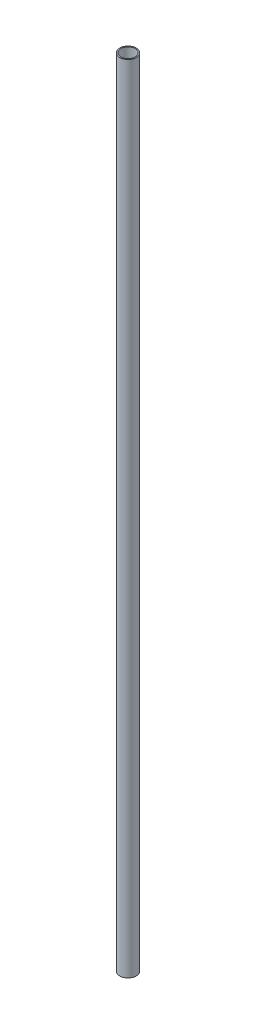
ISO-10303-21;
HEADER;
FILE_DESCRIPTION(('STEP AP214'),'2;1');
FILE_NAME('part.step','',(''),(''),'','','');
FILE_SCHEMA(('AUTOMOTIVE_DESIGN { 1 0 10303 214 1 1 1 1 }'));
ENDSEC;
DATA;
#1=APPLICATION_CONTEXT('core data for automotive mechanical design processes');
#2=APPLICATION_PROTOCOL_DEFINITION('international standard','automotive_design',2000,#1);
#3=PRODUCT_CONTEXT('',#1,'mechanical');
#4=PRODUCT('Part','Part','',(#3));
#5=PRODUCT_RELATED_PRODUCT_CATEGORY('part','',(#4));
#6=PRODUCT_DEFINITION_FORMATION('','',#4);
#7=PRODUCT_DEFINITION_CONTEXT('part definition',#1,'design');
#8=PRODUCT_DEFINITION('design','',#6,#7);
#9=PRODUCT_DEFINITION_SHAPE('','',#8);
#10=(LENGTH_UNIT() NAMED_UNIT(*) SI_UNIT(.MILLI.,.METRE.));
#11=(NAMED_UNIT(*) PLANE_ANGLE_UNIT() SI_UNIT($,.RADIAN.));
#12=(NAMED_UNIT(*) SI_UNIT($,.STERADIAN.) SOLID_ANGLE_UNIT());
#13=UNCERTAINTY_MEASURE_WITH_UNIT(LENGTH_MEASURE(1.E-05),#10,'distance_accuracy_value','');
#14=(GEOMETRIC_REPRESENTATION_CONTEXT(3) GLOBAL_UNCERTAINTY_ASSIGNED_CONTEXT((#13)) GLOBAL_UNIT_ASSIGNED_CONTEXT((#10,
#11,#12)) REPRESENTATION_CONTEXT('',''));
#15=CARTESIAN_POINT('',(0.,0.,0.));
#16=DIRECTION('',(0.,0.,1.));
#17=DIRECTION('',(1.,0.,0.));
#18=AXIS2_PLACEMENT_3D('',#15,#16,#17);
#19=CARTESIAN_POINT('',(0.,914.4,0.));
#20=DIRECTION('',(0.,1.,0.));
#21=DIRECTION('',(0.,0.,1.));
#22=AXIS2_PLACEMENT_3D('',#19,#20,#21);
#23=PLANE('',#22);
#24=CARTESIAN_POINT('',(0.,914.4,0.));
#25=DIRECTION('',(0.,1.,0.));
#26=DIRECTION('',(0.,0.,1.));
#27=AXIS2_PLACEMENT_3D('',#24,#25,#26);
#28=CIRCLE('',#27,9.525);
#29=CARTESIAN_POINT('',(0.,914.4,-9.525));
#30=VERTEX_POINT('',#29);
#31=EDGE_CURVE('E10',#30,#30,#28,.T.);
#32=ORIENTED_EDGE('',*,*,#31,.T.);
#33=EDGE_LOOP('',(#32));
#34=FACE_BOUND('',#33,.T.);
#35=CARTESIAN_POINT('',(0.,914.4,0.));
#36=DIRECTION('',(0.,1.,0.));
#37=DIRECTION('',(0.,0.,1.));
#38=AXIS2_PLACEMENT_3D('',#35,#36,#37);
#39=CIRCLE('',#38,8.2804);
#40=CARTESIAN_POINT('',(0.,914.4,-8.2804));
#41=VERTEX_POINT('',#40);
#42=EDGE_CURVE('E49',#41,#41,#39,.T.);
#43=ORIENTED_EDGE('',*,*,#42,.F.);
#44=EDGE_LOOP('',(#43));
#45=FACE_BOUND('',#44,.T.);
#46=ADVANCED_FACE('F38',(#34,#45),#23,.T.);
#47=CARTESIAN_POINT('',(0.,0.,0.));
#48=DIRECTION('',(0.,1.,0.));
#49=DIRECTION('',(0.,0.,1.));
#50=AXIS2_PLACEMENT_3D('',#47,#48,#49);
#51=PLANE('',#50);
#52=CARTESIAN_POINT('',(0.,0.,0.));
#53=DIRECTION('',(0.,1.,0.));
#54=DIRECTION('',(0.,0.,1.));
#55=AXIS2_PLACEMENT_3D('',#52,#53,#54);
#56=CIRCLE('',#55,9.525);
#57=CARTESIAN_POINT('',(0.,-1.11022302462516E-13,-9.525));
#58=VERTEX_POINT('',#57);
#59=EDGE_CURVE('E42',#58,#58,#56,.T.);
#60=ORIENTED_EDGE('',*,*,#59,.F.);
#61=EDGE_LOOP('',(#60));
#62=FACE_BOUND('',#61,.T.);
#63=CARTESIAN_POINT('',(0.,0.,0.));
#64=DIRECTION('',(0.,1.,0.));
#65=DIRECTION('',(0.,0.,1.));
#66=AXIS2_PLACEMENT_3D('',#63,#64,#65);
#67=CIRCLE('',#66,8.2804);
#68=CARTESIAN_POINT('',(0.,-1.11022302462516E-13,-8.2804));
#69=VERTEX_POINT('',#68);
#70=EDGE_CURVE('E51',#69,#69,#67,.T.);
#71=ORIENTED_EDGE('',*,*,#70,.T.);
#72=EDGE_LOOP('',(#71));
#73=FACE_BOUND('',#72,.T.);
#74=ADVANCED_FACE('F61',(#62,#73),#51,.F.);
#75=CARTESIAN_POINT('',(0.,914.4,0.));
#76=DIRECTION('',(0.,-1.,0.));
#77=DIRECTION('',(0.,0.,-1.));
#78=AXIS2_PLACEMENT_3D('',#75,#76,#77);
#79=CYLINDRICAL_SURFACE('',#78,9.525);
#80=CARTESIAN_POINT('',(0.,914.4,-9.525));
#81=CARTESIAN_POINT('',(0.,904.875,-9.525));
#82=CARTESIAN_POINT('',(0.,895.35,-9.525));
#83=CARTESIAN_POINT('',(0.,876.3,-9.525));
#84=CARTESIAN_POINT('',(0.,866.775,-9.525));
#85=CARTESIAN_POINT('',(0.,847.725,-9.525));
#86=CARTESIAN_POINT('',(0.,838.2,-9.525));
#87=CARTESIAN_POINT('',(0.,819.15,-9.525));
#88=CARTESIAN_POINT('',(0.,809.625,-9.525));
#89=CARTESIAN_POINT('',(0.,790.575,-9.525));
#90=CARTESIAN_POINT('',(0.,781.05,-9.525));
#91=CARTESIAN_POINT('',(0.,762.,-9.525));
#92=CARTESIAN_POINT('',(0.,752.475,-9.525));
#93=CARTESIAN_POINT('',(0.,733.425,-9.525));
#94=CARTESIAN_POINT('',(0.,723.9,-9.525));
#95=CARTESIAN_POINT('',(0.,704.85,-9.525));
#96=CARTESIAN_POINT('',(0.,695.325,-9.525));
#97=CARTESIAN_POINT('',(0.,676.275,-9.525));
#98=CARTESIAN_POINT('',(0.,666.75,-9.525));
#99=CARTESIAN_POINT('',(0.,647.7,-9.525));
#100=CARTESIAN_POINT('',(0.,638.175,-9.525));
#101=CARTESIAN_POINT('',(0.,619.125,-9.525));
#102=CARTESIAN_POINT('',(0.,609.6,-9.525));
#103=CARTESIAN_POINT('',(0.,590.55,-9.525));
#104=CARTESIAN_POINT('',(0.,581.025,-9.525));
#105=CARTESIAN_POINT('',(0.,561.975,-9.525));
#106=CARTESIAN_POINT('',(0.,552.45,-9.525));
#107=CARTESIAN_POINT('',(0.,533.4,-9.525));
#108=CARTESIAN_POINT('',(0.,523.875,-9.525));
#109=CARTESIAN_POINT('',(0.,504.825,-9.525));
#110=CARTESIAN_POINT('',(0.,495.3,-9.525));
#111=CARTESIAN_POINT('',(0.,476.25,-9.525));
#112=CARTESIAN_POINT('',(0.,466.725,-9.525));
#113=CARTESIAN_POINT('',(0.,447.675,-9.525));
#114=CARTESIAN_POINT('',(0.,438.15,-9.525));
#115=CARTESIAN_POINT('',(0.,419.1,-9.525));
#116=CARTESIAN_POINT('',(0.,409.575,-9.525));
#117=CARTESIAN_POINT('',(0.,390.525,-9.525));
#118=CARTESIAN_POINT('',(0.,381.,-9.525));
#119=CARTESIAN_POINT('',(0.,361.95,-9.525));
#120=CARTESIAN_POINT('',(0.,352.425,-9.525));
#121=CARTESIAN_POINT('',(0.,333.375,-9.525));
#122=CARTESIAN_POINT('',(0.,323.85,-9.525));
#123=CARTESIAN_POINT('',(0.,304.8,-9.525));
#124=CARTESIAN_POINT('',(0.,295.275,-9.525));
#125=CARTESIAN_POINT('',(0.,276.225,-9.525));
#126=CARTESIAN_POINT('',(0.,266.7,-9.525));
#127=CARTESIAN_POINT('',(0.,247.65,-9.525));
#128=CARTESIAN_POINT('',(0.,238.125,-9.525));
#129=CARTESIAN_POINT('',(0.,219.075,-9.525));
#130=CARTESIAN_POINT('',(0.,209.55,-9.525));
#131=CARTESIAN_POINT('',(0.,190.5,-9.525));
#132=CARTESIAN_POINT('',(0.,180.975,-9.525));
#133=CARTESIAN_POINT('',(0.,161.925,-9.525));
#134=CARTESIAN_POINT('',(0.,152.4,-9.525));
#135=CARTESIAN_POINT('',(0.,133.35,-9.525));
#136=CARTESIAN_POINT('',(0.,123.825,-9.525));
#137=CARTESIAN_POINT('',(0.,104.775,-9.525));
#138=CARTESIAN_POINT('',(0.,95.2499999999999,-9.525));
#139=CARTESIAN_POINT('',(0.,76.1999999999999,-9.525));
#140=CARTESIAN_POINT('',(0.,66.6749999999999,-9.525));
#141=CARTESIAN_POINT('',(0.,47.6249999999999,-9.525));
#142=CARTESIAN_POINT('',(0.,38.0999999999999,-9.525));
#143=CARTESIAN_POINT('',(0.,19.0499999999999,-9.525));
#144=CARTESIAN_POINT('',(0.,9.52499999999988,-9.525));
#145=CARTESIAN_POINT('',(0.,-1.11022302462516E-13,-9.525));
#146=B_SPLINE_CURVE_WITH_KNOTS('',3,(#80,#81,#82,#83,#84,#85,#86,#87,#88,#89,#90,#91,#92,#93,
#94,#95,#96,#97,#98,#99,#100,#101,#102,#103,#104,#105,#106,#107,#108,#109,#110,#111,#112,#113,
#114,#115,#116,#117,#118,#119,#120,#121,#122,#123,#124,#125,#126,#127,#128,#129,#130,#131,#132,
#133,#134,#135,#136,#137,#138,#139,#140,#141,#142,#143,#144,#145),.UNSPECIFIED.,.F.,.F.,(4,2,2,
2,2,2,2,2,2,2,2,2,2,2,2,2,2,2,2,2,2,2,2,2,2,2,2,2,2,2,2,2,4),(0.,28.5749999999999,
57.1499999999999,85.7249999999999,114.3,142.875,171.45,200.025,228.6,257.175,285.75,314.325,
342.9,371.475,400.05,428.625,457.2,485.775,514.35,542.925,571.5,600.075,628.65,657.225,685.8,
714.375,742.95,771.525,800.1,828.675,857.25,885.825,914.4),.UNSPECIFIED.);
#147=EDGE_CURVE('BSEAM40',#30,#58,#146,.T.);
#148=ORIENTED_EDGE('',*,*,#31,.F.);
#149=ORIENTED_EDGE('',*,*,#59,.T.);
#150=ORIENTED_EDGE('',*,*,#147,.T.);
#151=ORIENTED_EDGE('',*,*,#147,.F.);
#152=EDGE_LOOP('',(#148,#150,#149,#151));
#153=FACE_BOUND('',#152,.T.);
#154=ADVANCED_FACE('F40',(#153),#79,.T.);
#155=CARTESIAN_POINT('',(0.,914.4,0.));
#156=DIRECTION('',(0.,-1.,0.));
#157=DIRECTION('',(0.,0.,-1.));
#158=AXIS2_PLACEMENT_3D('',#155,#156,#157);
#159=CYLINDRICAL_SURFACE('',#158,8.2804);
#160=CARTESIAN_POINT('',(0.,914.4,-8.2804));
#161=CARTESIAN_POINT('',(0.,904.875,-8.2804));
#162=CARTESIAN_POINT('',(0.,895.35,-8.2804));
#163=CARTESIAN_POINT('',(0.,876.3,-8.2804));
#164=CARTESIAN_POINT('',(0.,866.775,-8.2804));
#165=CARTESIAN_POINT('',(0.,847.725,-8.2804));
#166=CARTESIAN_POINT('',(0.,838.2,-8.2804));
#167=CARTESIAN_POINT('',(0.,819.15,-8.2804));
#168=CARTESIAN_POINT('',(0.,809.625,-8.2804));
#169=CARTESIAN_POINT('',(0.,790.575,-8.2804));
#170=CARTESIAN_POINT('',(0.,781.05,-8.2804));
#171=CARTESIAN_POINT('',(0.,762.,-8.2804));
#172=CARTESIAN_POINT('',(0.,752.475,-8.2804));
#173=CARTESIAN_POINT('',(0.,733.425,-8.2804));
#174=CARTESIAN_POINT('',(0.,723.9,-8.2804));
#175=CARTESIAN_POINT('',(0.,704.85,-8.2804));
#176=CARTESIAN_POINT('',(0.,695.325,-8.2804));
#177=CARTESIAN_POINT('',(0.,676.275,-8.2804));
#178=CARTESIAN_POINT('',(0.,666.75,-8.2804));
#179=CARTESIAN_POINT('',(0.,647.7,-8.2804));
#180=CARTESIAN_POINT('',(0.,638.175,-8.2804));
#181=CARTESIAN_POINT('',(0.,619.125,-8.2804));
#182=CARTESIAN_POINT('',(0.,609.6,-8.2804));
#183=CARTESIAN_POINT('',(0.,590.55,-8.2804));
#184=CARTESIAN_POINT('',(0.,581.025,-8.2804));
#185=CARTESIAN_POINT('',(0.,561.975,-8.2804));
#186=CARTESIAN_POINT('',(0.,552.45,-8.2804));
#187=CARTESIAN_POINT('',(0.,533.4,-8.2804));
#188=CARTESIAN_POINT('',(0.,523.875,-8.2804));
#189=CARTESIAN_POINT('',(0.,504.825,-8.2804));
#190=CARTESIAN_POINT('',(0.,495.3,-8.2804));
#191=CARTESIAN_POINT('',(0.,476.25,-8.2804));
#192=CARTESIAN_POINT('',(0.,466.725,-8.2804));
#193=CARTESIAN_POINT('',(0.,447.675,-8.2804));
#194=CARTESIAN_POINT('',(0.,438.15,-8.2804));
#195=CARTESIAN_POINT('',(0.,419.1,-8.2804));
#196=CARTESIAN_POINT('',(0.,409.575,-8.2804));
#197=CARTESIAN_POINT('',(0.,390.525,-8.2804));
#198=CARTESIAN_POINT('',(0.,381.,-8.2804));
#199=CARTESIAN_POINT('',(0.,361.95,-8.2804));
#200=CARTESIAN_POINT('',(0.,352.425,-8.2804));
#201=CARTESIAN_POINT('',(0.,333.375,-8.2804));
#202=CARTESIAN_POINT('',(0.,323.85,-8.2804));
#203=CARTESIAN_POINT('',(0.,304.8,-8.2804));
#204=CARTESIAN_POINT('',(0.,295.275,-8.2804));
#205=CARTESIAN_POINT('',(0.,276.225,-8.2804));
#206=CARTESIAN_POINT('',(0.,266.7,-8.2804));
#207=CARTESIAN_POINT('',(0.,247.65,-8.2804));
#208=CARTESIAN_POINT('',(0.,238.125,-8.2804));
#209=CARTESIAN_POINT('',(0.,219.075,-8.2804));
#210=CARTESIAN_POINT('',(0.,209.55,-8.2804));
#211=CARTESIAN_POINT('',(0.,190.5,-8.2804));
#212=CARTESIAN_POINT('',(0.,180.975,-8.2804));
#213=CARTESIAN_POINT('',(0.,161.925,-8.2804));
#214=CARTESIAN_POINT('',(0.,152.4,-8.2804));
#215=CARTESIAN_POINT('',(0.,133.35,-8.2804));
#216=CARTESIAN_POINT('',(0.,123.825,-8.2804));
#217=CARTESIAN_POINT('',(0.,104.775,-8.2804));
#218=CARTESIAN_POINT('',(0.,95.2499999999999,-8.2804));
#219=CARTESIAN_POINT('',(0.,76.1999999999999,-8.2804));
#220=CARTESIAN_POINT('',(0.,66.6749999999999,-8.2804));
#221=CARTESIAN_POINT('',(0.,47.6249999999999,-8.2804));
#222=CARTESIAN_POINT('',(0.,38.0999999999999,-8.2804));
#223=CARTESIAN_POINT('',(0.,19.0499999999999,-8.2804));
#224=CARTESIAN_POINT('',(0.,9.52499999999988,-8.2804));
#225=CARTESIAN_POINT('',(0.,-1.11022302462516E-13,-8.2804));
#226=B_SPLINE_CURVE_WITH_KNOTS('',3,(#160,#161,#162,#163,#164,#165,#166,#167,#168,#169,#170,
#171,#172,#173,#174,#175,#176,#177,#178,#179,#180,#181,#182,#183,#184,#185,#186,#187,#188,#189,
#190,#191,#192,#193,#194,#195,#196,#197,#198,#199,#200,#201,#202,#203,#204,#205,#206,#207,#208,
#209,#210,#211,#212,#213,#214,#215,#216,#217,#218,#219,#220,#221,#222,#223,#224,#225),
.UNSPECIFIED.,.F.,.F.,(4,2,2,2,2,2,2,2,2,2,2,2,2,2,2,2,2,2,2,2,2,2,2,2,2,2,2,2,2,2,2,2,4),(0.,
28.575,57.15,85.7250000000001,114.3,142.875,171.45,200.025,228.6,257.175,285.75,314.325,342.9,
371.475,400.05,428.625,457.2,485.775,514.35,542.925,571.5,600.075,628.65,657.225,685.8,714.375,
742.95,771.525,800.1,828.675,857.25,885.825,914.4),.UNSPECIFIED.);
#227=EDGE_CURVE('BSEAM57',#41,#69,#226,.T.);
#228=ORIENTED_EDGE('',*,*,#42,.T.);
#229=ORIENTED_EDGE('',*,*,#70,.F.);
#230=ORIENTED_EDGE('',*,*,#227,.T.);
#231=ORIENTED_EDGE('',*,*,#227,.F.);
#232=EDGE_LOOP('',(#228,#230,#229,#231));
#233=FACE_BOUND('',#232,.T.);
#234=ADVANCED_FACE('F57',(#233),#159,.F.);
#235=CLOSED_SHELL('',(#46,#74,#154,#234));
#236=MANIFOLD_SOLID_BREP('B2',#235);
#237=ADVANCED_BREP_SHAPE_REPRESENTATION('',(#18,#236),#14);
#238=SHAPE_DEFINITION_REPRESENTATION(#9,#237);
ENDSEC;
END-ISO-10303-21;
